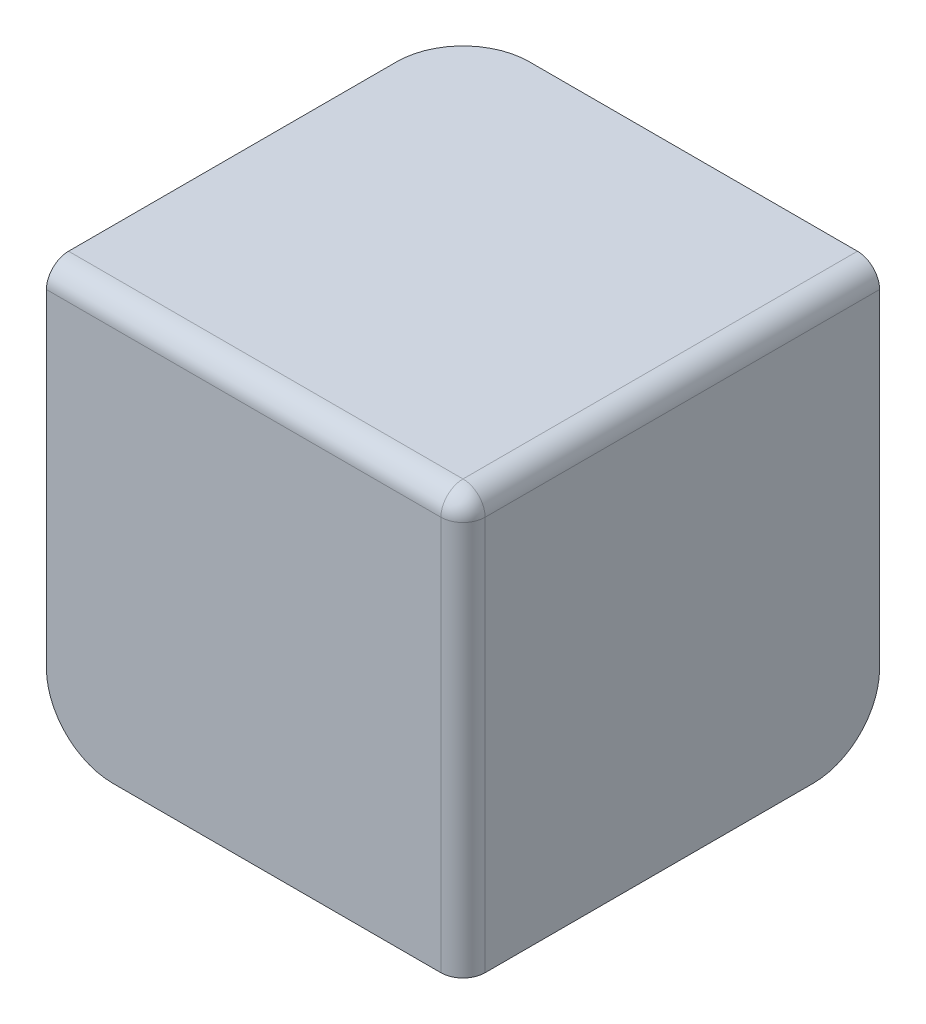
ISO-10303-21;
HEADER;
FILE_DESCRIPTION(('STEP AP214'),'2;1');
FILE_NAME('part.step','',(''),(''),'','','');
FILE_SCHEMA(('AUTOMOTIVE_DESIGN { 1 0 10303 214 1 1 1 1 }'));
ENDSEC;
DATA;
#1=APPLICATION_CONTEXT('core data for automotive mechanical design processes');
#2=APPLICATION_PROTOCOL_DEFINITION('international standard','automotive_design',2000,#1);
#3=PRODUCT_CONTEXT('',#1,'mechanical');
#4=PRODUCT('Part','Part','',(#3));
#5=PRODUCT_RELATED_PRODUCT_CATEGORY('part','',(#4));
#6=PRODUCT_DEFINITION_FORMATION('','',#4);
#7=PRODUCT_DEFINITION_CONTEXT('part definition',#1,'design');
#8=PRODUCT_DEFINITION('design','',#6,#7);
#9=PRODUCT_DEFINITION_SHAPE('','',#8);
#10=(LENGTH_UNIT() NAMED_UNIT(*) SI_UNIT(.MILLI.,.METRE.));
#11=(NAMED_UNIT(*) PLANE_ANGLE_UNIT() SI_UNIT($,.RADIAN.));
#12=(NAMED_UNIT(*) SI_UNIT($,.STERADIAN.) SOLID_ANGLE_UNIT());
#13=UNCERTAINTY_MEASURE_WITH_UNIT(LENGTH_MEASURE(1.E-05),#10,'distance_accuracy_value','');
#14=(GEOMETRIC_REPRESENTATION_CONTEXT(3) GLOBAL_UNCERTAINTY_ASSIGNED_CONTEXT((#13)) GLOBAL_UNIT_ASSIGNED_CONTEXT((#10,
#11,#12)) REPRESENTATION_CONTEXT('',''));
#15=CARTESIAN_POINT('',(0.,0.,0.));
#16=DIRECTION('',(0.,0.,1.));
#17=DIRECTION('',(1.,0.,0.));
#18=AXIS2_PLACEMENT_3D('',#15,#16,#17);
#19=CARTESIAN_POINT('',(9.42,18.84,9.42));
#20=DIRECTION('',(-1.,0.,0.));
#21=DIRECTION('',(0.,0.,1.));
#22=AXIS2_PLACEMENT_3D('',#19,#20,#21);
#23=PLANE('',#22);
#24=DIRECTION('',(0.,0.,-1.));
#25=VECTOR('',#24,1.);
#26=CARTESIAN_POINT('',(9.42,0.,9.42));
#27=LINE('',#26,#25);
#28=CARTESIAN_POINT('',(9.42,0.,8.42));
#29=VERTEX_POINT('',#28);
#30=CARTESIAN_POINT('',(9.42,0.,-6.42));
#31=VERTEX_POINT('',#30);
#32=EDGE_CURVE('E122',#29,#31,#27,.T.);
#33=ORIENTED_EDGE('',*,*,#32,.T.);
#34=CARTESIAN_POINT('',(9.42,3.,-6.42));
#35=DIRECTION('',(-1.,0.,0.));
#36=DIRECTION('',(0.,0.,1.));
#37=AXIS2_PLACEMENT_3D('',#34,#35,#36);
#38=CIRCLE('',#37,3.);
#39=CARTESIAN_POINT('',(9.42,3.,-9.42));
#40=VERTEX_POINT('',#39);
#41=EDGE_CURVE('E11',#31,#40,#38,.F.);
#42=ORIENTED_EDGE('',*,*,#41,.T.);
#43=DIRECTION('',(0.,-1.,0.));
#44=VECTOR('',#43,1.);
#45=CARTESIAN_POINT('',(9.42,18.84,-9.42));
#46=LINE('',#45,#44);
#47=CARTESIAN_POINT('',(9.42,17.84,-9.42));
#48=VERTEX_POINT('',#47);
#49=EDGE_CURVE('E145',#48,#40,#46,.T.);
#50=ORIENTED_EDGE('',*,*,#49,.F.);
#51=DIRECTION('',(0.,0.,-1.));
#52=VECTOR('',#51,1.);
#53=CARTESIAN_POINT('',(9.42,17.84,9.42));
#54=LINE('',#53,#52);
#55=CARTESIAN_POINT('',(9.42,17.84,8.42));
#56=VERTEX_POINT('',#55);
#57=EDGE_CURVE('E124',#48,#56,#54,.F.);
#58=ORIENTED_EDGE('',*,*,#57,.T.);
#59=DIRECTION('',(0.,-1.,0.));
#60=VECTOR('',#59,1.);
#61=CARTESIAN_POINT('',(9.42,18.84,8.42));
#62=LINE('',#61,#60);
#63=EDGE_CURVE('E115',#56,#29,#62,.T.);
#64=ORIENTED_EDGE('',*,*,#63,.T.);
#65=EDGE_LOOP('',(#33,#42,#50,#58,#64));
#66=FACE_BOUND('',#65,.T.);
#67=ADVANCED_FACE('F37',(#66),#23,.F.);
#68=CARTESIAN_POINT('',(-9.42,18.84,-9.42));
#69=DIRECTION('',(0.,0.,1.));
#70=DIRECTION('',(1.,0.,0.));
#71=AXIS2_PLACEMENT_3D('',#68,#69,#70);
#72=PLANE('',#71);
#73=DIRECTION('',(-1.,0.,0.));
#74=VECTOR('',#73,1.);
#75=CARTESIAN_POINT('',(-9.42,3.,-9.42));
#76=LINE('',#75,#74);
#77=CARTESIAN_POINT('',(-6.42,3.,-9.42));
#78=VERTEX_POINT('',#77);
#79=EDGE_CURVE('E54',#40,#78,#76,.T.);
#80=ORIENTED_EDGE('',*,*,#79,.T.);
#81=DIRECTION('',(0.,-1.,0.));
#82=VECTOR('',#81,1.);
#83=CARTESIAN_POINT('',(-6.42,18.84,-9.42));
#84=LINE('',#83,#82);
#85=CARTESIAN_POINT('',(-6.42,18.84,-9.42));
#86=VERTEX_POINT('',#85);
#87=EDGE_CURVE('E174',#78,#86,#84,.F.);
#88=ORIENTED_EDGE('',*,*,#87,.T.);
#89=DIRECTION('',(-1.,0.,0.));
#90=VECTOR('',#89,1.);
#91=CARTESIAN_POINT('',(-9.42,18.84,-9.42));
#92=LINE('',#91,#90);
#93=CARTESIAN_POINT('',(8.42,18.84,-9.42));
#94=VERTEX_POINT('',#93);
#95=EDGE_CURVE('E133',#94,#86,#92,.T.);
#96=ORIENTED_EDGE('',*,*,#95,.F.);
#97=CARTESIAN_POINT('',(8.42,17.84,-9.42));
#98=DIRECTION('',(0.,0.,1.));
#99=DIRECTION('',(1.,0.,0.));
#100=AXIS2_PLACEMENT_3D('',#97,#98,#99);
#101=CIRCLE('',#100,1.);
#102=EDGE_CURVE('E154',#94,#48,#101,.F.);
#103=ORIENTED_EDGE('',*,*,#102,.T.);
#104=ORIENTED_EDGE('',*,*,#49,.T.);
#105=EDGE_LOOP('',(#80,#88,#96,#103,#104));
#106=FACE_BOUND('',#105,.T.);
#107=ADVANCED_FACE('F217',(#106),#72,.F.);
#108=CARTESIAN_POINT('',(-9.42,18.84,9.42));
#109=DIRECTION('',(1.,0.,0.));
#110=DIRECTION('',(0.,0.,-1.));
#111=AXIS2_PLACEMENT_3D('',#108,#109,#110);
#112=PLANE('',#111);
#113=DIRECTION('',(0.,-1.,0.));
#114=VECTOR('',#113,1.);
#115=CARTESIAN_POINT('',(-9.42,18.84,-6.42));
#116=LINE('',#115,#114);
#117=CARTESIAN_POINT('',(-9.42,18.84,-6.42));
#118=VERTEX_POINT('',#117);
#119=CARTESIAN_POINT('',(-9.42,3.,-6.42));
#120=VERTEX_POINT('',#119);
#121=EDGE_CURVE('E159',#118,#120,#116,.T.);
#122=ORIENTED_EDGE('',*,*,#121,.T.);
#123=DIRECTION('',(0.,0.,1.));
#124=VECTOR('',#123,1.);
#125=CARTESIAN_POINT('',(-9.42,3.,9.42));
#126=LINE('',#125,#124);
#127=CARTESIAN_POINT('',(-9.42,3.,9.42));
#128=VERTEX_POINT('',#127);
#129=EDGE_CURVE('E165',#120,#128,#126,.T.);
#130=ORIENTED_EDGE('',*,*,#129,.T.);
#131=DIRECTION('',(0.,-1.,0.));
#132=VECTOR('',#131,1.);
#133=CARTESIAN_POINT('',(-9.42,18.84,9.42));
#134=LINE('',#133,#132);
#135=CARTESIAN_POINT('',(-9.42,17.84,9.42));
#136=VERTEX_POINT('',#135);
#137=EDGE_CURVE('E142',#136,#128,#134,.T.);
#138=ORIENTED_EDGE('',*,*,#137,.F.);
#139=CARTESIAN_POINT('',(-9.42,17.84,8.42));
#140=DIRECTION('',(1.,0.,0.));
#141=DIRECTION('',(0.,0.,-1.));
#142=AXIS2_PLACEMENT_3D('',#139,#140,#141);
#143=CIRCLE('',#142,1.);
#144=CARTESIAN_POINT('',(-9.42,18.84,8.42));
#145=VERTEX_POINT('',#144);
#146=EDGE_CURVE('E156',#136,#145,#143,.F.);
#147=ORIENTED_EDGE('',*,*,#146,.T.);
#148=DIRECTION('',(0.,0.,1.));
#149=VECTOR('',#148,1.);
#150=CARTESIAN_POINT('',(-9.42,18.84,9.42));
#151=LINE('',#150,#149);
#152=EDGE_CURVE('E139',#118,#145,#151,.T.);
#153=ORIENTED_EDGE('',*,*,#152,.F.);
#154=EDGE_LOOP('',(#122,#130,#138,#147,#153));
#155=FACE_BOUND('',#154,.T.);
#156=ADVANCED_FACE('F194',(#155),#112,.F.);
#157=CARTESIAN_POINT('',(-9.42,18.84,9.42));
#158=DIRECTION('',(0.,0.,-1.));
#159=DIRECTION('',(-1.,0.,0.));
#160=AXIS2_PLACEMENT_3D('',#157,#158,#159);
#161=PLANE('',#160);
#162=ORIENTED_EDGE('',*,*,#137,.T.);
#163=CARTESIAN_POINT('',(-6.42,3.,9.42));
#164=DIRECTION('',(0.,0.,-1.));
#165=DIRECTION('',(-1.,0.,0.));
#166=AXIS2_PLACEMENT_3D('',#163,#164,#165);
#167=CIRCLE('',#166,3.);
#168=CARTESIAN_POINT('',(-6.42,0.,9.42));
#169=VERTEX_POINT('',#168);
#170=EDGE_CURVE('E168',#128,#169,#167,.F.);
#171=ORIENTED_EDGE('',*,*,#170,.T.);
#172=DIRECTION('',(1.,0.,0.));
#173=VECTOR('',#172,1.);
#174=CARTESIAN_POINT('',(-9.42,0.,9.42));
#175=LINE('',#174,#173);
#176=CARTESIAN_POINT('',(8.42,0.,9.42));
#177=VERTEX_POINT('',#176);
#178=EDGE_CURVE('E130',#169,#177,#175,.T.);
#179=ORIENTED_EDGE('',*,*,#178,.T.);
#180=DIRECTION('',(0.,-1.,0.));
#181=VECTOR('',#180,1.);
#182=CARTESIAN_POINT('',(8.42,18.84,9.42));
#183=LINE('',#182,#181);
#184=CARTESIAN_POINT('',(8.42,17.84,9.42));
#185=VERTEX_POINT('',#184);
#186=EDGE_CURVE('E116',#177,#185,#183,.F.);
#187=ORIENTED_EDGE('',*,*,#186,.T.);
#188=DIRECTION('',(1.,0.,0.));
#189=VECTOR('',#188,1.);
#190=CARTESIAN_POINT('',(-9.42,17.84,9.42));
#191=LINE('',#190,#189);
#192=EDGE_CURVE('E120',#185,#136,#191,.F.);
#193=ORIENTED_EDGE('',*,*,#192,.T.);
#194=EDGE_LOOP('',(#162,#171,#179,#187,#193));
#195=FACE_BOUND('',#194,.T.);
#196=ADVANCED_FACE('F199',(#195),#161,.F.);
#197=CARTESIAN_POINT('',(0.,18.84,0.));
#198=DIRECTION('',(0.,-1.,0.));
#199=DIRECTION('',(0.,0.,-1.));
#200=AXIS2_PLACEMENT_3D('',#197,#198,#199);
#201=PLANE('',#200);
#202=ORIENTED_EDGE('',*,*,#95,.T.);
#203=CARTESIAN_POINT('',(-6.42,18.84,-6.42));
#204=DIRECTION('',(0.,-1.,0.));
#205=DIRECTION('',(0.,0.,-1.));
#206=AXIS2_PLACEMENT_3D('',#203,#204,#205);
#207=CIRCLE('',#206,3.);
#208=EDGE_CURVE('E46',#86,#118,#207,.F.);
#209=ORIENTED_EDGE('',*,*,#208,.T.);
#210=ORIENTED_EDGE('',*,*,#152,.T.);
#211=DIRECTION('',(1.,0.,0.));
#212=VECTOR('',#211,1.);
#213=CARTESIAN_POINT('',(0.,18.84,8.42));
#214=LINE('',#213,#212);
#215=CARTESIAN_POINT('',(8.42,18.84,8.42));
#216=VERTEX_POINT('',#215);
#217=EDGE_CURVE('E150',#145,#216,#214,.T.);
#218=ORIENTED_EDGE('',*,*,#217,.T.);
#219=DIRECTION('',(0.,0.,-1.));
#220=VECTOR('',#219,1.);
#221=CARTESIAN_POINT('',(8.42,18.84,0.));
#222=LINE('',#221,#220);
#223=EDGE_CURVE('E152',#216,#94,#222,.T.);
#224=ORIENTED_EDGE('',*,*,#223,.T.);
#225=EDGE_LOOP('',(#202,#209,#210,#218,#224));
#226=FACE_BOUND('',#225,.T.);
#227=ADVANCED_FACE('F215',(#226),#201,.F.);
#228=CARTESIAN_POINT('',(0.,0.,0.));
#229=DIRECTION('',(0.,-1.,0.));
#230=DIRECTION('',(0.,0.,-1.));
#231=AXIS2_PLACEMENT_3D('',#228,#229,#230);
#232=PLANE('',#231);
#233=ORIENTED_EDGE('',*,*,#178,.F.);
#234=DIRECTION('',(0.,0.,1.));
#235=VECTOR('',#234,1.);
#236=CARTESIAN_POINT('',(-6.42,0.,-9.42));
#237=LINE('',#236,#235);
#238=CARTESIAN_POINT('',(-6.42,0.,-6.42));
#239=VERTEX_POINT('',#238);
#240=EDGE_CURVE('E171',#169,#239,#237,.F.);
#241=ORIENTED_EDGE('',*,*,#240,.T.);
#242=DIRECTION('',(-1.,0.,0.));
#243=VECTOR('',#242,1.);
#244=CARTESIAN_POINT('',(9.42,0.,-6.42));
#245=LINE('',#244,#243);
#246=EDGE_CURVE('E129',#239,#31,#245,.F.);
#247=ORIENTED_EDGE('',*,*,#246,.T.);
#248=ORIENTED_EDGE('',*,*,#32,.F.);
#249=CARTESIAN_POINT('',(8.42,0.,8.42));
#250=DIRECTION('',(0.,-1.,0.));
#251=DIRECTION('',(0.,0.,-1.));
#252=AXIS2_PLACEMENT_3D('',#249,#250,#251);
#253=CIRCLE('',#252,1.);
#254=EDGE_CURVE('E111',#29,#177,#253,.T.);
#255=ORIENTED_EDGE('',*,*,#254,.T.);
#256=EDGE_LOOP('',(#233,#241,#247,#248,#255));
#257=FACE_BOUND('',#256,.T.);
#258=ADVANCED_FACE('F127',(#257),#232,.T.);
#259=CARTESIAN_POINT('',(0.,17.84,8.42));
#260=DIRECTION('',(1.,0.,0.));
#261=DIRECTION('',(0.,0.,-1.));
#262=AXIS2_PLACEMENT_3D('',#259,#260,#261);
#263=CYLINDRICAL_SURFACE('',#262,1.);
#264=ORIENTED_EDGE('',*,*,#146,.F.);
#265=ORIENTED_EDGE('',*,*,#192,.F.);
#266=CARTESIAN_POINT('',(8.42,17.84,8.42));
#267=DIRECTION('',(1.,0.,0.));
#268=DIRECTION('',(0.,0.,-1.));
#269=AXIS2_PLACEMENT_3D('',#266,#267,#268);
#270=CIRCLE('',#269,1.);
#271=EDGE_CURVE('E131',#216,#185,#270,.T.);
#272=ORIENTED_EDGE('',*,*,#271,.F.);
#273=ORIENTED_EDGE('',*,*,#217,.F.);
#274=EDGE_LOOP('',(#264,#265,#272,#273));
#275=FACE_BOUND('',#274,.T.);
#276=ADVANCED_FACE('F203',(#275),#263,.T.);
#277=CARTESIAN_POINT('',(8.42,17.84,0.));
#278=DIRECTION('',(0.,0.,-1.));
#279=DIRECTION('',(-1.,0.,0.));
#280=AXIS2_PLACEMENT_3D('',#277,#278,#279);
#281=CYLINDRICAL_SURFACE('',#280,1.);
#282=ORIENTED_EDGE('',*,*,#102,.F.);
#283=ORIENTED_EDGE('',*,*,#223,.F.);
#284=CARTESIAN_POINT('',(8.42,17.84,8.42));
#285=DIRECTION('',(0.,0.,1.));
#286=DIRECTION('',(1.,0.,0.));
#287=AXIS2_PLACEMENT_3D('',#284,#285,#286);
#288=CIRCLE('',#287,1.);
#289=EDGE_CURVE('E136',#56,#216,#288,.T.);
#290=ORIENTED_EDGE('',*,*,#289,.F.);
#291=ORIENTED_EDGE('',*,*,#57,.F.);
#292=EDGE_LOOP('',(#282,#283,#290,#291));
#293=FACE_BOUND('',#292,.T.);
#294=ADVANCED_FACE('F211',(#293),#281,.T.);
#295=CARTESIAN_POINT('',(8.42,17.84,8.42));
#296=DIRECTION('',(0.,0.,1.));
#297=DIRECTION('',(1.,0.,0.));
#298=AXIS2_PLACEMENT_3D('',#295,#296,#297);
#299=SPHERICAL_SURFACE('',#298,1.);
#300=ORIENTED_EDGE('',*,*,#289,.T.);
#301=ORIENTED_EDGE('',*,*,#271,.T.);
#302=CARTESIAN_POINT('',(8.42,17.84,8.42));
#303=DIRECTION('',(0.,1.,0.));
#304=DIRECTION('',(0.,0.,1.));
#305=AXIS2_PLACEMENT_3D('',#302,#303,#304);
#306=CIRCLE('',#305,1.);
#307=EDGE_CURVE('E160',#56,#185,#306,.F.);
#308=ORIENTED_EDGE('',*,*,#307,.F.);
#309=EDGE_LOOP('',(#300,#301,#308));
#310=FACE_BOUND('',#309,.T.);
#311=ADVANCED_FACE('F207',(#310),#299,.T.);
#312=CARTESIAN_POINT('',(8.42,18.84,8.42));
#313=DIRECTION('',(0.,-1.,0.));
#314=DIRECTION('',(0.,0.,-1.));
#315=AXIS2_PLACEMENT_3D('',#312,#313,#314);
#316=CYLINDRICAL_SURFACE('',#315,1.);
#317=ORIENTED_EDGE('',*,*,#307,.T.);
#318=ORIENTED_EDGE('',*,*,#186,.F.);
#319=ORIENTED_EDGE('',*,*,#254,.F.);
#320=ORIENTED_EDGE('',*,*,#63,.F.);
#321=EDGE_LOOP('',(#317,#318,#319,#320));
#322=FACE_BOUND('',#321,.T.);
#323=ADVANCED_FACE('F114',(#322),#316,.T.);
#324=CARTESIAN_POINT('',(-9.42,3.,-6.42));
#325=DIRECTION('',(1.,0.,0.));
#326=DIRECTION('',(0.,0.,-1.));
#327=AXIS2_PLACEMENT_3D('',#324,#325,#326);
#328=CYLINDRICAL_SURFACE('',#327,3.);
#329=ORIENTED_EDGE('',*,*,#41,.F.);
#330=ORIENTED_EDGE('',*,*,#246,.F.);
#331=CARTESIAN_POINT('',(-6.42,3.,-6.42));
#332=DIRECTION('',(-1.,0.,0.));
#333=DIRECTION('',(0.,0.,1.));
#334=AXIS2_PLACEMENT_3D('',#331,#332,#333);
#335=CIRCLE('',#334,3.);
#336=EDGE_CURVE('E41',#78,#239,#335,.T.);
#337=ORIENTED_EDGE('',*,*,#336,.F.);
#338=ORIENTED_EDGE('',*,*,#79,.F.);
#339=EDGE_LOOP('',(#329,#330,#337,#338));
#340=FACE_BOUND('',#339,.T.);
#341=ADVANCED_FACE('F39',(#340),#328,.T.);
#342=CARTESIAN_POINT('',(-6.42,18.84,-6.42));
#343=DIRECTION('',(0.,-1.,0.));
#344=DIRECTION('',(0.,0.,-1.));
#345=AXIS2_PLACEMENT_3D('',#342,#343,#344);
#346=CYLINDRICAL_SURFACE('',#345,3.);
#347=ORIENTED_EDGE('',*,*,#208,.F.);
#348=ORIENTED_EDGE('',*,*,#87,.F.);
#349=CARTESIAN_POINT('',(-6.42,3.,-6.42));
#350=DIRECTION('',(0.,-1.,0.));
#351=DIRECTION('',(0.,0.,-1.));
#352=AXIS2_PLACEMENT_3D('',#349,#350,#351);
#353=CIRCLE('',#352,3.);
#354=EDGE_CURVE('E179',#120,#78,#353,.T.);
#355=ORIENTED_EDGE('',*,*,#354,.F.);
#356=ORIENTED_EDGE('',*,*,#121,.F.);
#357=EDGE_LOOP('',(#347,#348,#355,#356));
#358=FACE_BOUND('',#357,.T.);
#359=ADVANCED_FACE('F219',(#358),#346,.T.);
#360=CARTESIAN_POINT('',(-6.42,3.,-6.42));
#361=DIRECTION('',(0.,0.,1.));
#362=DIRECTION('',(1.,0.,0.));
#363=AXIS2_PLACEMENT_3D('',#360,#361,#362);
#364=SPHERICAL_SURFACE('',#363,3.);
#365=ORIENTED_EDGE('',*,*,#354,.T.);
#366=ORIENTED_EDGE('',*,*,#336,.T.);
#367=CARTESIAN_POINT('',(-6.42,3.,-6.42));
#368=DIRECTION('',(0.,0.,-1.));
#369=DIRECTION('',(-1.,0.,0.));
#370=AXIS2_PLACEMENT_3D('',#367,#368,#369);
#371=CIRCLE('',#370,3.);
#372=EDGE_CURVE('E177',#120,#239,#371,.F.);
#373=ORIENTED_EDGE('',*,*,#372,.F.);
#374=EDGE_LOOP('',(#365,#366,#373));
#375=FACE_BOUND('',#374,.T.);
#376=ADVANCED_FACE('F186',(#375),#364,.T.);
#377=CARTESIAN_POINT('',(-6.42,3.,9.42));
#378=DIRECTION('',(0.,0.,-1.));
#379=DIRECTION('',(-1.,0.,0.));
#380=AXIS2_PLACEMENT_3D('',#377,#378,#379);
#381=CYLINDRICAL_SURFACE('',#380,3.);
#382=ORIENTED_EDGE('',*,*,#372,.T.);
#383=ORIENTED_EDGE('',*,*,#240,.F.);
#384=ORIENTED_EDGE('',*,*,#170,.F.);
#385=ORIENTED_EDGE('',*,*,#129,.F.);
#386=EDGE_LOOP('',(#382,#383,#384,#385));
#387=FACE_BOUND('',#386,.T.);
#388=ADVANCED_FACE('F191',(#387),#381,.T.);
#389=CLOSED_SHELL('',(#67,#107,#156,#196,#227,#258,#276,#294,#311,#323,#341,#359,#376,#388));
#390=MANIFOLD_SOLID_BREP('B2',#389);
#391=ADVANCED_BREP_SHAPE_REPRESENTATION('',(#18,#390),#14);
#392=SHAPE_DEFINITION_REPRESENTATION(#9,#391);
ENDSEC;
END-ISO-10303-21;
